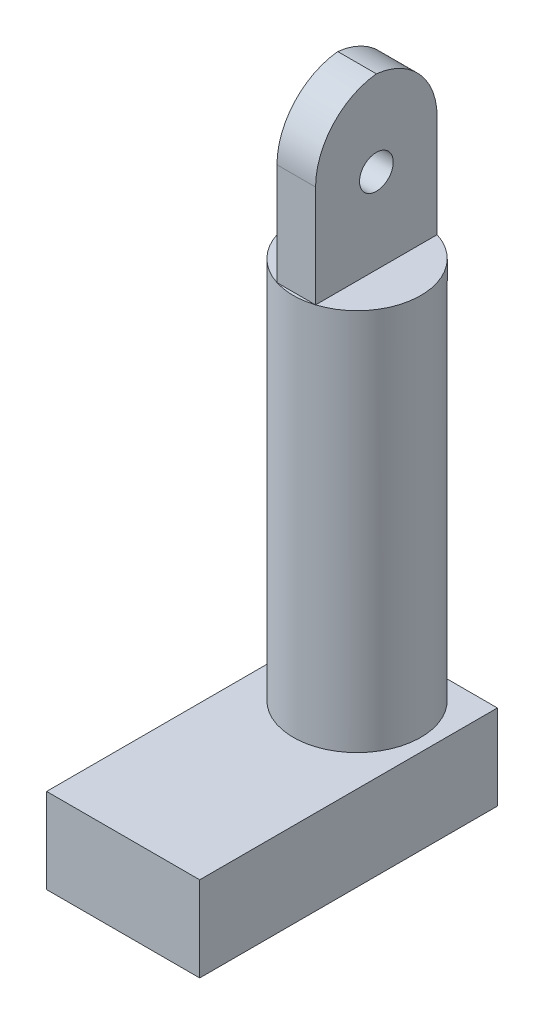
ISO-10303-21;
HEADER;
FILE_DESCRIPTION(('STEP AP214'),'2;1');
FILE_NAME('part.step','',(''),(''),'','','');
FILE_SCHEMA(('AUTOMOTIVE_DESIGN { 1 0 10303 214 1 1 1 1 }'));
ENDSEC;
DATA;
#1=APPLICATION_CONTEXT('core data for automotive mechanical design processes');
#2=APPLICATION_PROTOCOL_DEFINITION('international standard','automotive_design',2000,#1);
#3=PRODUCT_CONTEXT('',#1,'mechanical');
#4=PRODUCT('Part','Part','',(#3));
#5=PRODUCT_RELATED_PRODUCT_CATEGORY('part','',(#4));
#6=PRODUCT_DEFINITION_FORMATION('','',#4);
#7=PRODUCT_DEFINITION_CONTEXT('part definition',#1,'design');
#8=PRODUCT_DEFINITION('design','',#6,#7);
#9=PRODUCT_DEFINITION_SHAPE('','',#8);
#10=(LENGTH_UNIT() NAMED_UNIT(*) SI_UNIT(.MILLI.,.METRE.));
#11=(NAMED_UNIT(*) PLANE_ANGLE_UNIT() SI_UNIT($,.RADIAN.));
#12=(NAMED_UNIT(*) SI_UNIT($,.STERADIAN.) SOLID_ANGLE_UNIT());
#13=UNCERTAINTY_MEASURE_WITH_UNIT(LENGTH_MEASURE(1.E-05),#10,'distance_accuracy_value','');
#14=(GEOMETRIC_REPRESENTATION_CONTEXT(3) GLOBAL_UNCERTAINTY_ASSIGNED_CONTEXT((#13)) GLOBAL_UNIT_ASSIGNED_CONTEXT((#10,
#11,#12)) REPRESENTATION_CONTEXT('',''));
#15=CARTESIAN_POINT('',(0.,0.,0.));
#16=DIRECTION('',(0.,0.,1.));
#17=DIRECTION('',(1.,0.,0.));
#18=AXIS2_PLACEMENT_3D('',#15,#16,#17);
#19=CARTESIAN_POINT('',(0.,550.,-100.));
#20=DIRECTION('',(0.,1.,0.));
#21=DIRECTION('',(0.,0.,1.));
#22=AXIS2_PLACEMENT_3D('',#19,#20,#21);
#23=PLANE('',#22);
#24=DIRECTION('',(0.,0.,-1.));
#25=VECTOR('',#24,1.);
#26=CARTESIAN_POINT('',(22.709711891597,550.,-28.5208492929535));
#27=LINE('',#26,#25);
#28=CARTESIAN_POINT('',(22.709711891597,550.,-28.5208492929535));
#29=VERTEX_POINT('',#28);
#30=CARTESIAN_POINT('',(22.709711891597,550.,-171.479150707047));
#31=VERTEX_POINT('',#30);
#32=EDGE_CURVE('E156',#29,#31,#27,.T.);
#33=ORIENTED_EDGE('',*,*,#32,.F.);
#34=CARTESIAN_POINT('',(0.,550.,-100.));
#35=DIRECTION('',(0.,1.,0.));
#36=DIRECTION('',(0.,0.,1.));
#37=AXIS2_PLACEMENT_3D('',#34,#35,#36);
#38=CIRCLE('',#37,75.);
#39=EDGE_CURVE('E139',#29,#31,#38,.T.);
#40=ORIENTED_EDGE('',*,*,#39,.T.);
#41=EDGE_LOOP('',(#33,#40));
#42=FACE_BOUND('',#41,.T.);
#43=ADVANCED_FACE('F39',(#42),#23,.T.);
#44=DIRECTION('',(1.,0.,0.));
#45=VECTOR('',#44,1.);
#46=CARTESIAN_POINT('',(-22.709711891597,550.,-28.5208492929535));
#47=LINE('',#46,#45);
#48=CARTESIAN_POINT('',(-22.709711891597,550.,-28.5208492929535));
#49=VERTEX_POINT('',#48);
#50=EDGE_CURVE('E152',#49,#29,#47,.T.);
#51=ORIENTED_EDGE('',*,*,#50,.F.);
#52=EDGE_CURVE('E147',#49,#29,#38,.T.);
#53=ORIENTED_EDGE('',*,*,#52,.T.);
#54=EDGE_LOOP('',(#51,#53));
#55=FACE_BOUND('',#54,.T.);
#56=ADVANCED_FACE('F257',(#55),#23,.T.);
#57=DIRECTION('',(0.,0.,1.));
#58=VECTOR('',#57,1.);
#59=CARTESIAN_POINT('',(-22.709711891597,550.,-28.5208492929535));
#60=LINE('',#59,#58);
#61=CARTESIAN_POINT('',(-22.709711891597,550.,-171.479150707047));
#62=VERTEX_POINT('',#61);
#63=EDGE_CURVE('E117',#62,#49,#60,.T.);
#64=ORIENTED_EDGE('',*,*,#63,.F.);
#65=EDGE_CURVE('E140',#62,#49,#38,.T.);
#66=ORIENTED_EDGE('',*,*,#65,.T.);
#67=EDGE_LOOP('',(#64,#66));
#68=FACE_BOUND('',#67,.T.);
#69=ADVANCED_FACE('F150',(#68),#23,.T.);
#70=CARTESIAN_POINT('',(90.,100.,175.));
#71=DIRECTION('',(-1.,0.,0.));
#72=DIRECTION('',(0.,0.,1.));
#73=AXIS2_PLACEMENT_3D('',#70,#71,#72);
#74=PLANE('',#73);
#75=DIRECTION('',(0.,0.,-1.));
#76=VECTOR('',#75,1.);
#77=CARTESIAN_POINT('',(90.,0.,175.));
#78=LINE('',#77,#76);
#79=CARTESIAN_POINT('',(90.,0.,175.));
#80=VERTEX_POINT('',#79);
#81=CARTESIAN_POINT('',(90.,0.,-175.));
#82=VERTEX_POINT('',#81);
#83=EDGE_CURVE('E176',#80,#82,#78,.T.);
#84=ORIENTED_EDGE('',*,*,#83,.T.);
#85=DIRECTION('',(0.,-1.,0.));
#86=VECTOR('',#85,1.);
#87=CARTESIAN_POINT('',(90.,100.,-175.));
#88=LINE('',#87,#86);
#89=CARTESIAN_POINT('',(90.,100.,-175.));
#90=VERTEX_POINT('',#89);
#91=EDGE_CURVE('E218',#90,#82,#88,.T.);
#92=ORIENTED_EDGE('',*,*,#91,.F.);
#93=DIRECTION('',(0.,0.,-1.));
#94=VECTOR('',#93,1.);
#95=CARTESIAN_POINT('',(90.,100.,175.));
#96=LINE('',#95,#94);
#97=CARTESIAN_POINT('',(90.,100.,175.));
#98=VERTEX_POINT('',#97);
#99=EDGE_CURVE('E180',#98,#90,#96,.T.);
#100=ORIENTED_EDGE('',*,*,#99,.F.);
#101=DIRECTION('',(0.,-1.,0.));
#102=VECTOR('',#101,1.);
#103=CARTESIAN_POINT('',(90.,100.,175.));
#104=LINE('',#103,#102);
#105=EDGE_CURVE('E195',#98,#80,#104,.T.);
#106=ORIENTED_EDGE('',*,*,#105,.T.);
#107=EDGE_LOOP('',(#84,#92,#100,#106));
#108=FACE_BOUND('',#107,.T.);
#109=ADVANCED_FACE('F275',(#108),#74,.F.);
#110=CARTESIAN_POINT('',(-90.,100.,-175.));
#111=DIRECTION('',(0.,0.,1.));
#112=DIRECTION('',(1.,0.,0.));
#113=AXIS2_PLACEMENT_3D('',#110,#111,#112);
#114=PLANE('',#113);
#115=DIRECTION('',(-1.,0.,0.));
#116=VECTOR('',#115,1.);
#117=CARTESIAN_POINT('',(-90.,0.,-175.));
#118=LINE('',#117,#116);
#119=CARTESIAN_POINT('',(-90.,0.,-175.));
#120=VERTEX_POINT('',#119);
#121=EDGE_CURVE('E199',#82,#120,#118,.T.);
#122=ORIENTED_EDGE('',*,*,#121,.T.);
#123=DIRECTION('',(0.,-1.,0.));
#124=VECTOR('',#123,1.);
#125=CARTESIAN_POINT('',(-90.,100.,-175.));
#126=LINE('',#125,#124);
#127=CARTESIAN_POINT('',(-90.,100.,-175.));
#128=VERTEX_POINT('',#127);
#129=EDGE_CURVE('E214',#128,#120,#126,.T.);
#130=ORIENTED_EDGE('',*,*,#129,.F.);
#131=DIRECTION('',(-1.,0.,0.));
#132=VECTOR('',#131,1.);
#133=CARTESIAN_POINT('',(-90.,100.,-175.));
#134=LINE('',#133,#132);
#135=CARTESIAN_POINT('',(0.,100.,-175.));
#136=VERTEX_POINT('',#135);
#137=EDGE_CURVE('E184',#136,#128,#134,.T.);
#138=ORIENTED_EDGE('',*,*,#137,.F.);
#139=EDGE_CURVE('E186',#90,#136,#134,.T.);
#140=ORIENTED_EDGE('',*,*,#139,.F.);
#141=ORIENTED_EDGE('',*,*,#91,.T.);
#142=EDGE_LOOP('',(#122,#130,#138,#140,#141));
#143=FACE_BOUND('',#142,.T.);
#144=ADVANCED_FACE('F279',(#143),#114,.F.);
#145=CARTESIAN_POINT('',(-90.,100.,175.));
#146=DIRECTION('',(1.,0.,0.));
#147=DIRECTION('',(0.,0.,-1.));
#148=AXIS2_PLACEMENT_3D('',#145,#146,#147);
#149=PLANE('',#148);
#150=DIRECTION('',(0.,0.,1.));
#151=VECTOR('',#150,1.);
#152=CARTESIAN_POINT('',(-90.,0.,175.));
#153=LINE('',#152,#151);
#154=CARTESIAN_POINT('',(-90.,0.,175.));
#155=VERTEX_POINT('',#154);
#156=EDGE_CURVE('E202',#120,#155,#153,.T.);
#157=ORIENTED_EDGE('',*,*,#156,.T.);
#158=DIRECTION('',(0.,-1.,0.));
#159=VECTOR('',#158,1.);
#160=CARTESIAN_POINT('',(-90.,100.,175.));
#161=LINE('',#160,#159);
#162=CARTESIAN_POINT('',(-90.,100.,175.));
#163=VERTEX_POINT('',#162);
#164=EDGE_CURVE('E210',#163,#155,#161,.T.);
#165=ORIENTED_EDGE('',*,*,#164,.F.);
#166=DIRECTION('',(0.,0.,1.));
#167=VECTOR('',#166,1.);
#168=CARTESIAN_POINT('',(-90.,100.,175.));
#169=LINE('',#168,#167);
#170=EDGE_CURVE('E189',#128,#163,#169,.T.);
#171=ORIENTED_EDGE('',*,*,#170,.F.);
#172=ORIENTED_EDGE('',*,*,#129,.T.);
#173=EDGE_LOOP('',(#157,#165,#171,#172));
#174=FACE_BOUND('',#173,.T.);
#175=ADVANCED_FACE('F285',(#174),#149,.F.);
#176=CARTESIAN_POINT('',(-90.,100.,175.));
#177=DIRECTION('',(0.,0.,-1.));
#178=DIRECTION('',(-1.,0.,0.));
#179=AXIS2_PLACEMENT_3D('',#176,#177,#178);
#180=PLANE('',#179);
#181=DIRECTION('',(1.,0.,0.));
#182=VECTOR('',#181,1.);
#183=CARTESIAN_POINT('',(-90.,0.,175.));
#184=LINE('',#183,#182);
#185=EDGE_CURVE('E185',#155,#80,#184,.T.);
#186=ORIENTED_EDGE('',*,*,#185,.T.);
#187=ORIENTED_EDGE('',*,*,#105,.F.);
#188=DIRECTION('',(1.,0.,0.));
#189=VECTOR('',#188,1.);
#190=CARTESIAN_POINT('',(-90.,100.,175.));
#191=LINE('',#190,#189);
#192=EDGE_CURVE('E192',#163,#98,#191,.T.);
#193=ORIENTED_EDGE('',*,*,#192,.F.);
#194=ORIENTED_EDGE('',*,*,#164,.T.);
#195=EDGE_LOOP('',(#186,#187,#193,#194));
#196=FACE_BOUND('',#195,.T.);
#197=ADVANCED_FACE('F291',(#196),#180,.F.);
#198=CARTESIAN_POINT('',(0.,100.,0.));
#199=DIRECTION('',(0.,-1.,0.));
#200=DIRECTION('',(0.,0.,-1.));
#201=AXIS2_PLACEMENT_3D('',#198,#199,#200);
#202=PLANE('',#201);
#203=ORIENTED_EDGE('',*,*,#139,.T.);
#204=CARTESIAN_POINT('',(0.,100.,-100.));
#205=DIRECTION('',(0.,1.,0.));
#206=DIRECTION('',(0.,0.,1.));
#207=AXIS2_PLACEMENT_3D('',#204,#205,#206);
#208=CIRCLE('',#207,75.);
#209=EDGE_CURVE('E173',#136,#136,#208,.T.);
#210=ORIENTED_EDGE('',*,*,#209,.F.);
#211=ORIENTED_EDGE('',*,*,#137,.T.);
#212=ORIENTED_EDGE('',*,*,#170,.T.);
#213=ORIENTED_EDGE('',*,*,#192,.T.);
#214=ORIENTED_EDGE('',*,*,#99,.T.);
#215=EDGE_LOOP('',(#203,#210,#211,#212,#213,#214));
#216=FACE_BOUND('',#215,.T.);
#217=ADVANCED_FACE('F295',(#216),#202,.F.);
#218=CARTESIAN_POINT('',(0.,0.,0.));
#219=DIRECTION('',(0.,-1.,0.));
#220=DIRECTION('',(0.,0.,-1.));
#221=AXIS2_PLACEMENT_3D('',#218,#219,#220);
#222=PLANE('',#221);
#223=ORIENTED_EDGE('',*,*,#83,.F.);
#224=ORIENTED_EDGE('',*,*,#185,.F.);
#225=ORIENTED_EDGE('',*,*,#156,.F.);
#226=ORIENTED_EDGE('',*,*,#121,.F.);
#227=EDGE_LOOP('',(#223,#224,#225,#226));
#228=FACE_BOUND('',#227,.T.);
#229=ADVANCED_FACE('F273',(#228),#222,.T.);
#230=CARTESIAN_POINT('',(0.,550.,-100.));
#231=DIRECTION('',(0.,-1.,0.));
#232=DIRECTION('',(0.,0.,-1.));
#233=AXIS2_PLACEMENT_3D('',#230,#231,#232);
#234=CYLINDRICAL_SURFACE('',#233,75.);
#235=ORIENTED_EDGE('',*,*,#39,.F.);
#236=ORIENTED_EDGE('',*,*,#52,.F.);
#237=ORIENTED_EDGE('',*,*,#65,.F.);
#238=EDGE_CURVE('E131',#31,#62,#38,.T.);
#239=ORIENTED_EDGE('',*,*,#238,.F.);
#240=EDGE_LOOP('',(#235,#236,#237,#239));
#241=FACE_BOUND('',#240,.T.);
#242=ORIENTED_EDGE('',*,*,#209,.T.);
#243=EDGE_LOOP('',(#242));
#244=FACE_BOUND('',#243,.T.);
#245=ADVANCED_FACE('F144',(#241,#244),#234,.T.);
#246=DIRECTION('',(-1.,0.,0.));
#247=VECTOR('',#246,1.);
#248=CARTESIAN_POINT('',(-22.709711891597,550.,-171.479150707047));
#249=LINE('',#248,#247);
#250=EDGE_CURVE('E134',#31,#62,#249,.T.);
#251=ORIENTED_EDGE('',*,*,#250,.F.);
#252=ORIENTED_EDGE('',*,*,#238,.T.);
#253=EDGE_LOOP('',(#251,#252));
#254=FACE_BOUND('',#253,.T.);
#255=ADVANCED_FACE('F133',(#254),#23,.T.);
#256=CARTESIAN_POINT('',(22.709711891597,750.,-28.5208492929535));
#257=DIRECTION('',(-1.,0.,0.));
#258=DIRECTION('',(0.,0.,1.));
#259=AXIS2_PLACEMENT_3D('',#256,#257,#258);
#260=PLANE('',#259);
#261=CARTESIAN_POINT('',(22.709711891597,649.772462607082,-100.));
#262=DIRECTION('',(-1.,0.,0.));
#263=DIRECTION('',(0.,0.,1.));
#264=AXIS2_PLACEMENT_3D('',#261,#262,#263);
#265=CIRCLE('',#264,19.8124224852063);
#266=CARTESIAN_POINT('',(22.709711891597,649.772462607082,-80.1875775147939));
#267=VERTEX_POINT('',#266);
#268=EDGE_CURVE('E235',#267,#267,#265,.T.);
#269=ORIENTED_EDGE('',*,*,#268,.T.);
#270=EDGE_LOOP('',(#269));
#271=FACE_BOUND('',#270,.T.);
#272=DIRECTION('',(0.,-1.,0.));
#273=VECTOR('',#272,1.);
#274=CARTESIAN_POINT('',(22.709711891597,750.,-171.479150707047));
#275=LINE('',#274,#273);
#276=CARTESIAN_POINT('',(22.709711891597,670.,-171.479150707047));
#277=VERTEX_POINT('',#276);
#278=EDGE_CURVE('E125',#277,#31,#275,.T.);
#279=ORIENTED_EDGE('',*,*,#278,.F.);
#280=CARTESIAN_POINT('',(22.709711891597,670.,-91.4791507070465));
#281=DIRECTION('',(-1.,0.,0.));
#282=DIRECTION('',(0.,0.,1.));
#283=AXIS2_PLACEMENT_3D('',#280,#281,#282);
#284=CIRCLE('',#283,80.);
#285=CARTESIAN_POINT('',(22.709711891597,749.544925214163,-100.));
#286=VERTEX_POINT('',#285);
#287=EDGE_CURVE('E49',#277,#286,#284,.F.);
#288=ORIENTED_EDGE('',*,*,#287,.T.);
#289=CARTESIAN_POINT('',(22.709711891597,670.,-108.520849292954));
#290=DIRECTION('',(-1.,0.,0.));
#291=DIRECTION('',(0.,0.,1.));
#292=AXIS2_PLACEMENT_3D('',#289,#290,#291);
#293=CIRCLE('',#292,80.);
#294=CARTESIAN_POINT('',(22.709711891597,670.,-28.5208492929535));
#295=VERTEX_POINT('',#294);
#296=EDGE_CURVE('E60',#286,#295,#293,.F.);
#297=ORIENTED_EDGE('',*,*,#296,.T.);
#298=DIRECTION('',(0.,-1.,0.));
#299=VECTOR('',#298,1.);
#300=CARTESIAN_POINT('',(22.709711891597,750.,-28.5208492929535));
#301=LINE('',#300,#299);
#302=EDGE_CURVE('E167',#295,#29,#301,.T.);
#303=ORIENTED_EDGE('',*,*,#302,.T.);
#304=ORIENTED_EDGE('',*,*,#32,.T.);
#305=EDGE_LOOP('',(#279,#288,#297,#303,#304));
#306=FACE_BOUND('',#305,.T.);
#307=ADVANCED_FACE('F268',(#271,#306),#260,.F.);
#308=CARTESIAN_POINT('',(-22.709711891597,750.,-171.479150707047));
#309=DIRECTION('',(0.,0.,1.));
#310=DIRECTION('',(1.,0.,0.));
#311=AXIS2_PLACEMENT_3D('',#308,#309,#310);
#312=PLANE('',#311);
#313=DIRECTION('',(0.,-1.,0.));
#314=VECTOR('',#313,1.);
#315=CARTESIAN_POINT('',(-22.709711891597,750.,-171.479150707047));
#316=LINE('',#315,#314);
#317=CARTESIAN_POINT('',(-22.709711891597,670.,-171.479150707047));
#318=VERTEX_POINT('',#317);
#319=EDGE_CURVE('E112',#318,#62,#316,.T.);
#320=ORIENTED_EDGE('',*,*,#319,.F.);
#321=DIRECTION('',(-1.,0.,0.));
#322=VECTOR('',#321,1.);
#323=CARTESIAN_POINT('',(-22.709711891597,670.,-171.479150707047));
#324=LINE('',#323,#322);
#325=EDGE_CURVE('E227',#318,#277,#324,.F.);
#326=ORIENTED_EDGE('',*,*,#325,.T.);
#327=ORIENTED_EDGE('',*,*,#278,.T.);
#328=ORIENTED_EDGE('',*,*,#250,.T.);
#329=EDGE_LOOP('',(#320,#326,#327,#328));
#330=FACE_BOUND('',#329,.T.);
#331=ADVANCED_FACE('F154',(#330),#312,.F.);
#332=CARTESIAN_POINT('',(-22.709711891597,750.,-28.5208492929535));
#333=DIRECTION('',(1.,0.,0.));
#334=DIRECTION('',(0.,0.,-1.));
#335=AXIS2_PLACEMENT_3D('',#332,#333,#334);
#336=PLANE('',#335);
#337=CARTESIAN_POINT('',(-22.709711891597,649.772462607082,-100.));
#338=DIRECTION('',(1.,0.,0.));
#339=DIRECTION('',(0.,0.,-1.));
#340=AXIS2_PLACEMENT_3D('',#337,#338,#339);
#341=CIRCLE('',#340,19.8124224852063);
#342=CARTESIAN_POINT('',(-22.709711891597,649.772462607082,-119.812422485207));
#343=VERTEX_POINT('',#342);
#344=EDGE_CURVE('E43',#343,#343,#341,.T.);
#345=ORIENTED_EDGE('',*,*,#344,.T.);
#346=EDGE_LOOP('',(#345));
#347=FACE_BOUND('',#346,.T.);
#348=CARTESIAN_POINT('',(-22.709711891597,670.,-108.520849292954));
#349=DIRECTION('',(1.,0.,0.));
#350=DIRECTION('',(0.,0.,-1.));
#351=AXIS2_PLACEMENT_3D('',#348,#349,#350);
#352=CIRCLE('',#351,80.);
#353=CARTESIAN_POINT('',(-22.709711891597,670.,-28.5208492929535));
#354=VERTEX_POINT('',#353);
#355=CARTESIAN_POINT('',(-22.709711891597,749.544925214163,-100.));
#356=VERTEX_POINT('',#355);
#357=EDGE_CURVE('E222',#354,#356,#352,.F.);
#358=ORIENTED_EDGE('',*,*,#357,.T.);
#359=CARTESIAN_POINT('',(-22.709711891597,670.,-91.4791507070465));
#360=DIRECTION('',(1.,0.,0.));
#361=DIRECTION('',(0.,0.,-1.));
#362=AXIS2_PLACEMENT_3D('',#359,#360,#361);
#363=CIRCLE('',#362,80.);
#364=EDGE_CURVE('E119',#356,#318,#363,.F.);
#365=ORIENTED_EDGE('',*,*,#364,.T.);
#366=ORIENTED_EDGE('',*,*,#319,.T.);
#367=ORIENTED_EDGE('',*,*,#63,.T.);
#368=DIRECTION('',(0.,-1.,0.));
#369=VECTOR('',#368,1.);
#370=CARTESIAN_POINT('',(-22.709711891597,750.,-28.5208492929535));
#371=LINE('',#370,#369);
#372=EDGE_CURVE('E126',#354,#49,#371,.T.);
#373=ORIENTED_EDGE('',*,*,#372,.F.);
#374=EDGE_LOOP('',(#358,#365,#366,#367,#373));
#375=FACE_BOUND('',#374,.T.);
#376=ADVANCED_FACE('F114',(#347,#375),#336,.F.);
#377=CARTESIAN_POINT('',(-22.709711891597,750.,-28.5208492929535));
#378=DIRECTION('',(0.,0.,-1.));
#379=DIRECTION('',(-1.,0.,0.));
#380=AXIS2_PLACEMENT_3D('',#377,#378,#379);
#381=PLANE('',#380);
#382=ORIENTED_EDGE('',*,*,#302,.F.);
#383=DIRECTION('',(1.,0.,0.));
#384=VECTOR('',#383,1.);
#385=CARTESIAN_POINT('',(-22.709711891597,670.,-28.5208492929535));
#386=LINE('',#385,#384);
#387=EDGE_CURVE('E11',#295,#354,#386,.F.);
#388=ORIENTED_EDGE('',*,*,#387,.T.);
#389=ORIENTED_EDGE('',*,*,#372,.T.);
#390=ORIENTED_EDGE('',*,*,#50,.T.);
#391=EDGE_LOOP('',(#382,#388,#389,#390));
#392=FACE_BOUND('',#391,.T.);
#393=ADVANCED_FACE('F314',(#392),#381,.F.);
#394=CARTESIAN_POINT('',(0.,670.,-108.520849292954));
#395=DIRECTION('',(1.,0.,0.));
#396=DIRECTION('',(0.,0.,-1.));
#397=AXIS2_PLACEMENT_3D('',#394,#395,#396);
#398=CYLINDRICAL_SURFACE('',#397,80.);
#399=ORIENTED_EDGE('',*,*,#387,.F.);
#400=ORIENTED_EDGE('',*,*,#296,.F.);
#401=DIRECTION('',(1.,0.,0.));
#402=VECTOR('',#401,1.);
#403=CARTESIAN_POINT('',(0.,749.544925214163,-100.));
#404=LINE('',#403,#402);
#405=EDGE_CURVE('E160',#356,#286,#404,.T.);
#406=ORIENTED_EDGE('',*,*,#405,.F.);
#407=ORIENTED_EDGE('',*,*,#357,.F.);
#408=EDGE_LOOP('',(#399,#400,#406,#407));
#409=FACE_BOUND('',#408,.T.);
#410=ADVANCED_FACE('F41',(#409),#398,.T.);
#411=CARTESIAN_POINT('',(0.,670.,-91.4791507070465));
#412=DIRECTION('',(-1.,0.,0.));
#413=DIRECTION('',(0.,0.,1.));
#414=AXIS2_PLACEMENT_3D('',#411,#412,#413);
#415=CYLINDRICAL_SURFACE('',#414,80.);
#416=ORIENTED_EDGE('',*,*,#287,.F.);
#417=ORIENTED_EDGE('',*,*,#325,.F.);
#418=ORIENTED_EDGE('',*,*,#364,.F.);
#419=ORIENTED_EDGE('',*,*,#405,.T.);
#420=EDGE_LOOP('',(#416,#417,#418,#419));
#421=FACE_BOUND('',#420,.T.);
#422=ADVANCED_FACE('F250',(#421),#415,.T.);
#423=CARTESIAN_POINT('',(-90.,649.772462607082,-100.));
#424=DIRECTION('',(1.,0.,0.));
#425=DIRECTION('',(0.,0.,-1.));
#426=AXIS2_PLACEMENT_3D('',#423,#424,#425);
#427=CYLINDRICAL_SURFACE('',#426,19.8124224852063);
#428=ORIENTED_EDGE('',*,*,#344,.F.);
#429=EDGE_LOOP('',(#428));
#430=FACE_BOUND('',#429,.T.);
#431=ORIENTED_EDGE('',*,*,#268,.F.);
#432=EDGE_LOOP('',(#431));
#433=FACE_BOUND('',#432,.T.);
#434=ADVANCED_FACE('F247',(#430,#433),#427,.F.);
#435=CLOSED_SHELL('',(#43,#56,#69,#109,#144,#175,#197,#217,#229,#245,#255,#307,#331,#376,#393,
#410,#422,#434));
#436=MANIFOLD_SOLID_BREP('B2',#435);
#437=ADVANCED_BREP_SHAPE_REPRESENTATION('',(#18,#436),#14);
#438=SHAPE_DEFINITION_REPRESENTATION(#9,#437);
ENDSEC;
END-ISO-10303-21;
